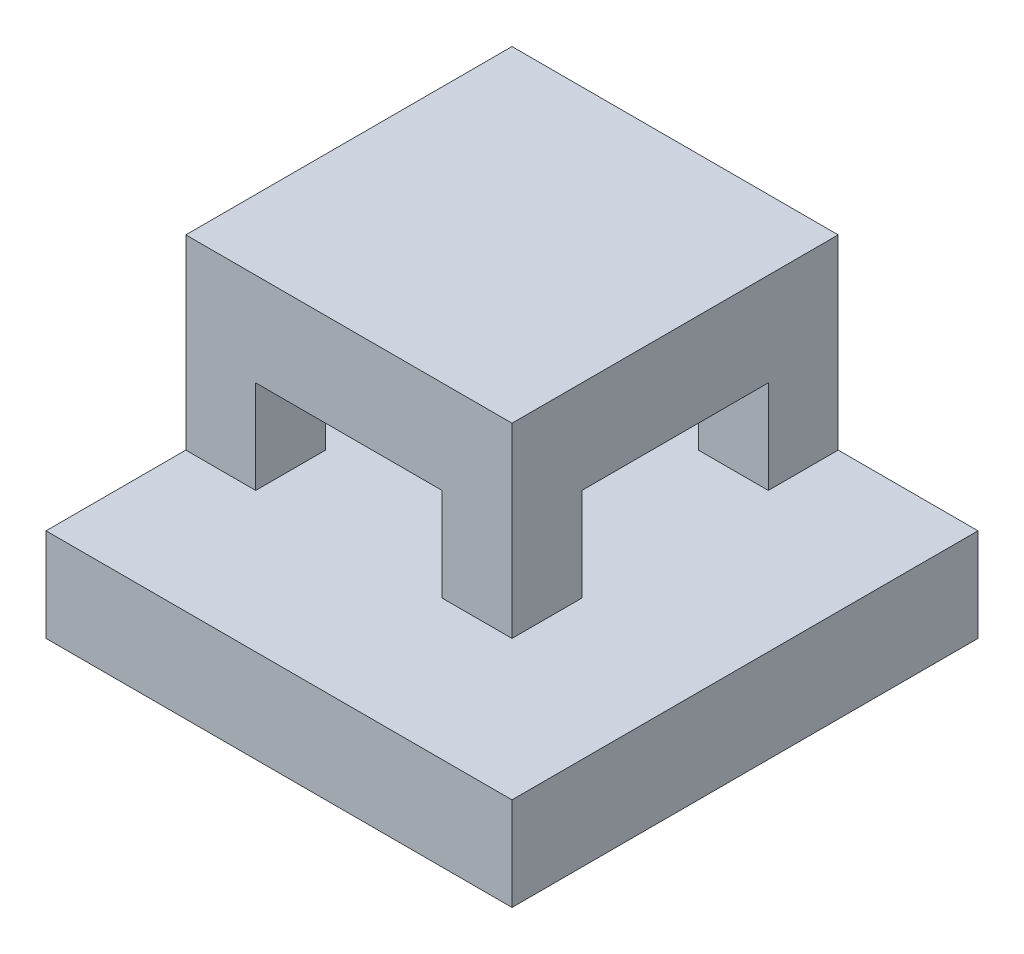
ISO-10303-21;
HEADER;
FILE_DESCRIPTION(('STEP AP214'),'2;1');
FILE_NAME('part.step','',(''),(''),'','','');
FILE_SCHEMA(('AUTOMOTIVE_DESIGN { 1 0 10303 214 1 1 1 1 }'));
ENDSEC;
DATA;
#1=APPLICATION_CONTEXT('core data for automotive mechanical design processes');
#2=APPLICATION_PROTOCOL_DEFINITION('international standard','automotive_design',2000,#1);
#3=PRODUCT_CONTEXT('',#1,'mechanical');
#4=PRODUCT('Part','Part','',(#3));
#5=PRODUCT_RELATED_PRODUCT_CATEGORY('part','',(#4));
#6=PRODUCT_DEFINITION_FORMATION('','',#4);
#7=PRODUCT_DEFINITION_CONTEXT('part definition',#1,'design');
#8=PRODUCT_DEFINITION('design','',#6,#7);
#9=PRODUCT_DEFINITION_SHAPE('','',#8);
#10=(LENGTH_UNIT() NAMED_UNIT(*) SI_UNIT(.MILLI.,.METRE.));
#11=(NAMED_UNIT(*) PLANE_ANGLE_UNIT() SI_UNIT($,.RADIAN.));
#12=(NAMED_UNIT(*) SI_UNIT($,.STERADIAN.) SOLID_ANGLE_UNIT());
#13=UNCERTAINTY_MEASURE_WITH_UNIT(LENGTH_MEASURE(1.E-05),#10,'distance_accuracy_value','');
#14=(GEOMETRIC_REPRESENTATION_CONTEXT(3) GLOBAL_UNCERTAINTY_ASSIGNED_CONTEXT((#13)) GLOBAL_UNIT_ASSIGNED_CONTEXT((#10,
#11,#12)) REPRESENTATION_CONTEXT('',''));
#15=CARTESIAN_POINT('',(0.,0.,0.));
#16=DIRECTION('',(0.,0.,1.));
#17=DIRECTION('',(1.,0.,0.));
#18=AXIS2_PLACEMENT_3D('',#15,#16,#17);
#19=CARTESIAN_POINT('',(0.,20.,0.));
#20=DIRECTION('',(0.,-1.,0.));
#21=DIRECTION('',(0.,0.,-1.));
#22=AXIS2_PLACEMENT_3D('',#19,#20,#21);
#23=PLANE('',#22);
#24=DIRECTION('',(0.,0.,-1.));
#25=VECTOR('',#24,1.);
#26=CARTESIAN_POINT('',(-35.,20.,-35.));
#27=LINE('',#26,#25);
#28=CARTESIAN_POINT('',(-35.,20.,-35.));
#29=VERTEX_POINT('',#28);
#30=CARTESIAN_POINT('',(-35.,20.,-50.));
#31=VERTEX_POINT('',#30);
#32=EDGE_CURVE('E254',#29,#31,#27,.T.);
#33=ORIENTED_EDGE('',*,*,#32,.F.);
#34=DIRECTION('',(1.,0.,0.));
#35=VECTOR('',#34,1.);
#36=CARTESIAN_POINT('',(-50.,20.,-35.));
#37=LINE('',#36,#35);
#38=CARTESIAN_POINT('',(-50.,20.,-35.));
#39=VERTEX_POINT('',#38);
#40=EDGE_CURVE('E260',#39,#29,#37,.T.);
#41=ORIENTED_EDGE('',*,*,#40,.F.);
#42=DIRECTION('',(0.,0.,1.));
#43=VECTOR('',#42,1.);
#44=CARTESIAN_POINT('',(-50.,20.,50.));
#45=LINE('',#44,#43);
#46=CARTESIAN_POINT('',(-50.,20.,5.));
#47=VERTEX_POINT('',#46);
#48=EDGE_CURVE('E362',#39,#47,#45,.T.);
#49=ORIENTED_EDGE('',*,*,#48,.T.);
#50=DIRECTION('',(-1.,0.,0.));
#51=VECTOR('',#50,1.);
#52=CARTESIAN_POINT('',(-50.,20.,5.));
#53=LINE('',#52,#51);
#54=CARTESIAN_POINT('',(-35.,20.,5.));
#55=VERTEX_POINT('',#54);
#56=EDGE_CURVE('E331',#55,#47,#53,.T.);
#57=ORIENTED_EDGE('',*,*,#56,.F.);
#58=DIRECTION('',(0.,0.,-1.));
#59=VECTOR('',#58,1.);
#60=CARTESIAN_POINT('',(-35.,20.,20.));
#61=LINE('',#60,#59);
#62=CARTESIAN_POINT('',(-35.,20.,20.));
#63=VERTEX_POINT('',#62);
#64=EDGE_CURVE('E317',#63,#55,#61,.T.);
#65=ORIENTED_EDGE('',*,*,#64,.F.);
#66=DIRECTION('',(1.,0.,0.));
#67=VECTOR('',#66,1.);
#68=CARTESIAN_POINT('',(-50.,20.,20.));
#69=LINE('',#68,#67);
#70=CARTESIAN_POINT('',(-50.,20.,20.));
#71=VERTEX_POINT('',#70);
#72=EDGE_CURVE('E323',#71,#63,#69,.T.);
#73=ORIENTED_EDGE('',*,*,#72,.F.);
#74=CARTESIAN_POINT('',(-50.,20.,50.));
#75=VERTEX_POINT('',#74);
#76=EDGE_CURVE('E361',#71,#75,#45,.T.);
#77=ORIENTED_EDGE('',*,*,#76,.T.);
#78=DIRECTION('',(1.,0.,0.));
#79=VECTOR('',#78,1.);
#80=CARTESIAN_POINT('',(-50.,20.,50.));
#81=LINE('',#80,#79);
#82=CARTESIAN_POINT('',(50.,20.,50.));
#83=VERTEX_POINT('',#82);
#84=EDGE_CURVE('E365',#75,#83,#81,.T.);
#85=ORIENTED_EDGE('',*,*,#84,.T.);
#86=DIRECTION('',(0.,0.,-1.));
#87=VECTOR('',#86,1.);
#88=CARTESIAN_POINT('',(50.,20.,50.));
#89=LINE('',#88,#87);
#90=CARTESIAN_POINT('',(50.,20.,-50.));
#91=VERTEX_POINT('',#90);
#92=EDGE_CURVE('E352',#83,#91,#89,.T.);
#93=ORIENTED_EDGE('',*,*,#92,.T.);
#94=DIRECTION('',(-1.,0.,0.));
#95=VECTOR('',#94,1.);
#96=CARTESIAN_POINT('',(-50.,20.,-50.));
#97=LINE('',#96,#95);
#98=CARTESIAN_POINT('',(20.,20.,-50.));
#99=VERTEX_POINT('',#98);
#100=EDGE_CURVE('E358',#91,#99,#97,.T.);
#101=ORIENTED_EDGE('',*,*,#100,.T.);
#102=DIRECTION('',(0.,0.,-1.));
#103=VECTOR('',#102,1.);
#104=CARTESIAN_POINT('',(20.,20.,-35.));
#105=LINE('',#104,#103);
#106=CARTESIAN_POINT('',(20.,20.,-35.));
#107=VERTEX_POINT('',#106);
#108=EDGE_CURVE('E282',#107,#99,#105,.T.);
#109=ORIENTED_EDGE('',*,*,#108,.F.);
#110=DIRECTION('',(1.,0.,0.));
#111=VECTOR('',#110,1.);
#112=CARTESIAN_POINT('',(5.,20.,-35.));
#113=LINE('',#112,#111);
#114=CARTESIAN_POINT('',(5.,20.,-35.));
#115=VERTEX_POINT('',#114);
#116=EDGE_CURVE('E288',#115,#107,#113,.T.);
#117=ORIENTED_EDGE('',*,*,#116,.F.);
#118=DIRECTION('',(0.,0.,1.));
#119=VECTOR('',#118,1.);
#120=CARTESIAN_POINT('',(5.,20.,-35.));
#121=LINE('',#120,#119);
#122=CARTESIAN_POINT('',(5.,20.,-50.));
#123=VERTEX_POINT('',#122);
#124=EDGE_CURVE('E296',#123,#115,#121,.T.);
#125=ORIENTED_EDGE('',*,*,#124,.F.);
#126=EDGE_CURVE('E356',#123,#31,#97,.T.);
#127=ORIENTED_EDGE('',*,*,#126,.T.);
#128=EDGE_LOOP('',(#33,#41,#49,#57,#65,#73,#77,#85,#93,#101,#109,#117,#125,#127));
#129=FACE_BOUND('',#128,.T.);
#130=DIRECTION('',(0.,0.,-1.));
#131=VECTOR('',#130,1.);
#132=CARTESIAN_POINT('',(20.,20.,20.));
#133=LINE('',#132,#131);
#134=CARTESIAN_POINT('',(20.,20.,20.));
#135=VERTEX_POINT('',#134);
#136=CARTESIAN_POINT('',(20.,20.,5.));
#137=VERTEX_POINT('',#136);
#138=EDGE_CURVE('E208',#135,#137,#133,.T.);
#139=ORIENTED_EDGE('',*,*,#138,.F.);
#140=DIRECTION('',(1.,0.,0.));
#141=VECTOR('',#140,1.);
#142=CARTESIAN_POINT('',(5.,20.,20.));
#143=LINE('',#142,#141);
#144=CARTESIAN_POINT('',(5.,20.,20.));
#145=VERTEX_POINT('',#144);
#146=EDGE_CURVE('E225',#145,#135,#143,.T.);
#147=ORIENTED_EDGE('',*,*,#146,.F.);
#148=DIRECTION('',(0.,0.,1.));
#149=VECTOR('',#148,1.);
#150=CARTESIAN_POINT('',(5.,20.,20.));
#151=LINE('',#150,#149);
#152=CARTESIAN_POINT('',(5.,20.,5.));
#153=VERTEX_POINT('',#152);
#154=EDGE_CURVE('E60',#153,#145,#151,.T.);
#155=ORIENTED_EDGE('',*,*,#154,.F.);
#156=DIRECTION('',(-1.,0.,0.));
#157=VECTOR('',#156,1.);
#158=CARTESIAN_POINT('',(5.,20.,5.));
#159=LINE('',#158,#157);
#160=EDGE_CURVE('E55',#137,#153,#159,.T.);
#161=ORIENTED_EDGE('',*,*,#160,.F.);
#162=EDGE_LOOP('',(#139,#147,#155,#161));
#163=FACE_BOUND('',#162,.T.);
#164=ADVANCED_FACE('F39',(#129,#163),#23,.F.);
#165=CARTESIAN_POINT('',(50.,20.,50.));
#166=DIRECTION('',(-1.,0.,0.));
#167=DIRECTION('',(0.,0.,1.));
#168=AXIS2_PLACEMENT_3D('',#165,#166,#167);
#169=PLANE('',#168);
#170=DIRECTION('',(0.,0.,-1.));
#171=VECTOR('',#170,1.);
#172=CARTESIAN_POINT('',(50.,0.,50.));
#173=LINE('',#172,#171);
#174=CARTESIAN_POINT('',(50.,0.,50.));
#175=VERTEX_POINT('',#174);
#176=CARTESIAN_POINT('',(50.,0.,-50.));
#177=VERTEX_POINT('',#176);
#178=EDGE_CURVE('E351',#175,#177,#173,.T.);
#179=ORIENTED_EDGE('',*,*,#178,.T.);
#180=DIRECTION('',(0.,-1.,0.));
#181=VECTOR('',#180,1.);
#182=CARTESIAN_POINT('',(50.,20.,-50.));
#183=LINE('',#182,#181);
#184=EDGE_CURVE('E11',#91,#177,#183,.T.);
#185=ORIENTED_EDGE('',*,*,#184,.F.);
#186=ORIENTED_EDGE('',*,*,#92,.F.);
#187=DIRECTION('',(0.,-1.,0.));
#188=VECTOR('',#187,1.);
#189=CARTESIAN_POINT('',(50.,20.,50.));
#190=LINE('',#189,#188);
#191=EDGE_CURVE('E368',#83,#175,#190,.T.);
#192=ORIENTED_EDGE('',*,*,#191,.T.);
#193=EDGE_LOOP('',(#179,#185,#186,#192));
#194=FACE_BOUND('',#193,.T.);
#195=ADVANCED_FACE('F41',(#194),#169,.F.);
#196=CARTESIAN_POINT('',(-50.,20.,-50.));
#197=DIRECTION('',(0.,0.,1.));
#198=DIRECTION('',(1.,0.,0.));
#199=AXIS2_PLACEMENT_3D('',#196,#197,#198);
#200=PLANE('',#199);
#201=DIRECTION('',(0.,-1.,0.));
#202=VECTOR('',#201,1.);
#203=CARTESIAN_POINT('',(5.,40.,-50.));
#204=LINE('',#203,#202);
#205=CARTESIAN_POINT('',(5.,40.,-50.));
#206=VERTEX_POINT('',#205);
#207=EDGE_CURVE('E310',#206,#123,#204,.T.);
#208=ORIENTED_EDGE('',*,*,#207,.F.);
#209=DIRECTION('',(-1.,0.,0.));
#210=VECTOR('',#209,1.);
#211=CARTESIAN_POINT('',(-50.,40.,-50.));
#212=LINE('',#211,#210);
#213=CARTESIAN_POINT('',(-35.,40.,-50.));
#214=VERTEX_POINT('',#213);
#215=EDGE_CURVE('E209',#206,#214,#212,.T.);
#216=ORIENTED_EDGE('',*,*,#215,.T.);
#217=DIRECTION('',(0.,-1.,0.));
#218=VECTOR('',#217,1.);
#219=CARTESIAN_POINT('',(-35.,40.,-50.));
#220=LINE('',#219,#218);
#221=EDGE_CURVE('E278',#214,#31,#220,.T.);
#222=ORIENTED_EDGE('',*,*,#221,.T.);
#223=ORIENTED_EDGE('',*,*,#126,.F.);
#224=EDGE_LOOP('',(#208,#216,#222,#223));
#225=FACE_BOUND('',#224,.T.);
#226=DIRECTION('',(-1.,0.,0.));
#227=VECTOR('',#226,1.);
#228=CARTESIAN_POINT('',(-50.,0.,-50.));
#229=LINE('',#228,#227);
#230=CARTESIAN_POINT('',(-50.,0.,-50.));
#231=VERTEX_POINT('',#230);
#232=EDGE_CURVE('E174',#177,#231,#229,.T.);
#233=ORIENTED_EDGE('',*,*,#232,.T.);
#234=DIRECTION('',(0.,-1.,0.));
#235=VECTOR('',#234,1.);
#236=CARTESIAN_POINT('',(-50.,20.,-50.));
#237=LINE('',#236,#235);
#238=CARTESIAN_POINT('',(-50.,60.,-50.));
#239=VERTEX_POINT('',#238);
#240=EDGE_CURVE('E48',#239,#231,#237,.T.);
#241=ORIENTED_EDGE('',*,*,#240,.F.);
#242=DIRECTION('',(-1.,0.,0.));
#243=VECTOR('',#242,1.);
#244=CARTESIAN_POINT('',(-50.,60.,-50.));
#245=LINE('',#244,#243);
#246=CARTESIAN_POINT('',(20.,60.,-50.));
#247=VERTEX_POINT('',#246);
#248=EDGE_CURVE('E173',#247,#239,#245,.T.);
#249=ORIENTED_EDGE('',*,*,#248,.F.);
#250=DIRECTION('',(0.,-1.,0.));
#251=VECTOR('',#250,1.);
#252=CARTESIAN_POINT('',(20.,40.,-50.));
#253=LINE('',#252,#251);
#254=EDGE_CURVE('E314',#247,#99,#253,.T.);
#255=ORIENTED_EDGE('',*,*,#254,.T.);
#256=ORIENTED_EDGE('',*,*,#100,.F.);
#257=ORIENTED_EDGE('',*,*,#184,.T.);
#258=EDGE_LOOP('',(#233,#241,#249,#255,#256,#257));
#259=FACE_BOUND('',#258,.T.);
#260=ADVANCED_FACE('F170',(#225,#259),#200,.F.);
#261=CARTESIAN_POINT('',(-50.,20.,50.));
#262=DIRECTION('',(1.,0.,0.));
#263=DIRECTION('',(0.,0.,-1.));
#264=AXIS2_PLACEMENT_3D('',#261,#262,#263);
#265=PLANE('',#264);
#266=DIRECTION('',(0.,-1.,0.));
#267=VECTOR('',#266,1.);
#268=CARTESIAN_POINT('',(-50.,40.,20.));
#269=LINE('',#268,#267);
#270=CARTESIAN_POINT('',(-50.,60.,20.));
#271=VERTEX_POINT('',#270);
#272=EDGE_CURVE('E185',#271,#71,#269,.T.);
#273=ORIENTED_EDGE('',*,*,#272,.F.);
#274=DIRECTION('',(0.,0.,1.));
#275=VECTOR('',#274,1.);
#276=CARTESIAN_POINT('',(-50.,60.,20.));
#277=LINE('',#276,#275);
#278=EDGE_CURVE('E180',#239,#271,#277,.T.);
#279=ORIENTED_EDGE('',*,*,#278,.F.);
#280=ORIENTED_EDGE('',*,*,#240,.T.);
#281=DIRECTION('',(0.,0.,1.));
#282=VECTOR('',#281,1.);
#283=CARTESIAN_POINT('',(-50.,0.,50.));
#284=LINE('',#283,#282);
#285=CARTESIAN_POINT('',(-50.,0.,50.));
#286=VERTEX_POINT('',#285);
#287=EDGE_CURVE('E374',#231,#286,#284,.T.);
#288=ORIENTED_EDGE('',*,*,#287,.T.);
#289=DIRECTION('',(0.,-1.,0.));
#290=VECTOR('',#289,1.);
#291=CARTESIAN_POINT('',(-50.,20.,50.));
#292=LINE('',#291,#290);
#293=EDGE_CURVE('E178',#75,#286,#292,.T.);
#294=ORIENTED_EDGE('',*,*,#293,.F.);
#295=ORIENTED_EDGE('',*,*,#76,.F.);
#296=EDGE_LOOP('',(#273,#279,#280,#288,#294,#295));
#297=FACE_BOUND('',#296,.T.);
#298=DIRECTION('',(0.,0.,1.));
#299=VECTOR('',#298,1.);
#300=CARTESIAN_POINT('',(-50.,40.,20.));
#301=LINE('',#300,#299);
#302=CARTESIAN_POINT('',(-50.,40.,-35.));
#303=VERTEX_POINT('',#302);
#304=CARTESIAN_POINT('',(-50.,40.,5.));
#305=VERTEX_POINT('',#304);
#306=EDGE_CURVE('E213',#303,#305,#301,.T.);
#307=ORIENTED_EDGE('',*,*,#306,.T.);
#308=DIRECTION('',(0.,-1.,0.));
#309=VECTOR('',#308,1.);
#310=CARTESIAN_POINT('',(-50.,40.,5.));
#311=LINE('',#310,#309);
#312=EDGE_CURVE('E343',#305,#47,#311,.T.);
#313=ORIENTED_EDGE('',*,*,#312,.T.);
#314=ORIENTED_EDGE('',*,*,#48,.F.);
#315=DIRECTION('',(0.,-1.,0.));
#316=VECTOR('',#315,1.);
#317=CARTESIAN_POINT('',(-50.,40.,-35.));
#318=LINE('',#317,#316);
#319=EDGE_CURVE('E274',#303,#39,#318,.T.);
#320=ORIENTED_EDGE('',*,*,#319,.F.);
#321=EDGE_LOOP('',(#307,#313,#314,#320));
#322=FACE_BOUND('',#321,.T.);
#323=ADVANCED_FACE('F181',(#297,#322),#265,.F.);
#324=CARTESIAN_POINT('',(-50.,20.,50.));
#325=DIRECTION('',(0.,0.,-1.));
#326=DIRECTION('',(-1.,0.,0.));
#327=AXIS2_PLACEMENT_3D('',#324,#325,#326);
#328=PLANE('',#327);
#329=DIRECTION('',(1.,0.,0.));
#330=VECTOR('',#329,1.);
#331=CARTESIAN_POINT('',(-50.,0.,50.));
#332=LINE('',#331,#330);
#333=EDGE_CURVE('E357',#286,#175,#332,.T.);
#334=ORIENTED_EDGE('',*,*,#333,.T.);
#335=ORIENTED_EDGE('',*,*,#191,.F.);
#336=ORIENTED_EDGE('',*,*,#84,.F.);
#337=ORIENTED_EDGE('',*,*,#293,.T.);
#338=EDGE_LOOP('',(#334,#335,#336,#337));
#339=FACE_BOUND('',#338,.T.);
#340=ADVANCED_FACE('F388',(#339),#328,.F.);
#341=CARTESIAN_POINT('',(0.,0.,0.));
#342=DIRECTION('',(0.,-1.,0.));
#343=DIRECTION('',(0.,0.,-1.));
#344=AXIS2_PLACEMENT_3D('',#341,#342,#343);
#345=PLANE('',#344);
#346=ORIENTED_EDGE('',*,*,#178,.F.);
#347=ORIENTED_EDGE('',*,*,#333,.F.);
#348=ORIENTED_EDGE('',*,*,#287,.F.);
#349=ORIENTED_EDGE('',*,*,#232,.F.);
#350=EDGE_LOOP('',(#346,#347,#348,#349));
#351=FACE_BOUND('',#350,.T.);
#352=ADVANCED_FACE('F392',(#351),#345,.T.);
#353=CARTESIAN_POINT('',(-35.,40.,20.));
#354=DIRECTION('',(-1.,0.,0.));
#355=DIRECTION('',(0.,0.,1.));
#356=AXIS2_PLACEMENT_3D('',#353,#354,#355);
#357=PLANE('',#356);
#358=ORIENTED_EDGE('',*,*,#64,.T.);
#359=DIRECTION('',(0.,-1.,0.));
#360=VECTOR('',#359,1.);
#361=CARTESIAN_POINT('',(-35.,40.,5.));
#362=LINE('',#361,#360);
#363=CARTESIAN_POINT('',(-35.,40.,5.));
#364=VERTEX_POINT('',#363);
#365=EDGE_CURVE('E347',#364,#55,#362,.T.);
#366=ORIENTED_EDGE('',*,*,#365,.F.);
#367=DIRECTION('',(0.,0.,-1.));
#368=VECTOR('',#367,1.);
#369=CARTESIAN_POINT('',(-35.,40.,20.));
#370=LINE('',#369,#368);
#371=CARTESIAN_POINT('',(-35.,40.,20.));
#372=VERTEX_POINT('',#371);
#373=EDGE_CURVE('E318',#372,#364,#370,.T.);
#374=ORIENTED_EDGE('',*,*,#373,.F.);
#375=DIRECTION('',(0.,-1.,0.));
#376=VECTOR('',#375,1.);
#377=CARTESIAN_POINT('',(-35.,40.,20.));
#378=LINE('',#377,#376);
#379=EDGE_CURVE('E327',#372,#63,#378,.T.);
#380=ORIENTED_EDGE('',*,*,#379,.T.);
#381=EDGE_LOOP('',(#358,#366,#374,#380));
#382=FACE_BOUND('',#381,.T.);
#383=ADVANCED_FACE('F418',(#382),#357,.F.);
#384=CARTESIAN_POINT('',(-50.,40.,5.));
#385=DIRECTION('',(0.,0.,1.));
#386=DIRECTION('',(1.,0.,0.));
#387=AXIS2_PLACEMENT_3D('',#384,#385,#386);
#388=PLANE('',#387);
#389=ORIENTED_EDGE('',*,*,#56,.T.);
#390=ORIENTED_EDGE('',*,*,#312,.F.);
#391=DIRECTION('',(-1.,0.,0.));
#392=VECTOR('',#391,1.);
#393=CARTESIAN_POINT('',(-50.,40.,5.));
#394=LINE('',#393,#392);
#395=EDGE_CURVE('E322',#364,#305,#394,.T.);
#396=ORIENTED_EDGE('',*,*,#395,.F.);
#397=ORIENTED_EDGE('',*,*,#365,.T.);
#398=EDGE_LOOP('',(#389,#390,#396,#397));
#399=FACE_BOUND('',#398,.T.);
#400=ADVANCED_FACE('F410',(#399),#388,.F.);
#401=CARTESIAN_POINT('',(-50.,40.,20.));
#402=DIRECTION('',(0.,0.,-1.));
#403=DIRECTION('',(-1.,0.,0.));
#404=AXIS2_PLACEMENT_3D('',#401,#402,#403);
#405=PLANE('',#404);
#406=ORIENTED_EDGE('',*,*,#72,.T.);
#407=ORIENTED_EDGE('',*,*,#379,.F.);
#408=DIRECTION('',(1.,0.,0.));
#409=VECTOR('',#408,1.);
#410=CARTESIAN_POINT('',(-50.,40.,20.));
#411=LINE('',#410,#409);
#412=CARTESIAN_POINT('',(5.,40.,20.));
#413=VERTEX_POINT('',#412);
#414=EDGE_CURVE('E201',#372,#413,#411,.T.);
#415=ORIENTED_EDGE('',*,*,#414,.T.);
#416=DIRECTION('',(0.,-1.,0.));
#417=VECTOR('',#416,1.);
#418=CARTESIAN_POINT('',(5.,40.,20.));
#419=LINE('',#418,#417);
#420=EDGE_CURVE('E243',#413,#145,#419,.T.);
#421=ORIENTED_EDGE('',*,*,#420,.T.);
#422=ORIENTED_EDGE('',*,*,#146,.T.);
#423=DIRECTION('',(0.,-1.,0.));
#424=VECTOR('',#423,1.);
#425=CARTESIAN_POINT('',(20.,40.,20.));
#426=LINE('',#425,#424);
#427=CARTESIAN_POINT('',(20.,60.,20.));
#428=VERTEX_POINT('',#427);
#429=EDGE_CURVE('E229',#428,#135,#426,.T.);
#430=ORIENTED_EDGE('',*,*,#429,.F.);
#431=DIRECTION('',(1.,0.,0.));
#432=VECTOR('',#431,1.);
#433=CARTESIAN_POINT('',(-50.,60.,20.));
#434=LINE('',#433,#432);
#435=EDGE_CURVE('E190',#271,#428,#434,.T.);
#436=ORIENTED_EDGE('',*,*,#435,.F.);
#437=ORIENTED_EDGE('',*,*,#272,.T.);
#438=EDGE_LOOP('',(#406,#407,#415,#421,#422,#430,#436,#437));
#439=FACE_BOUND('',#438,.T.);
#440=ADVANCED_FACE('F421',(#439),#405,.F.);
#441=CARTESIAN_POINT('',(20.,40.,-35.));
#442=DIRECTION('',(-1.,0.,0.));
#443=DIRECTION('',(0.,0.,1.));
#444=AXIS2_PLACEMENT_3D('',#441,#442,#443);
#445=PLANE('',#444);
#446=ORIENTED_EDGE('',*,*,#108,.T.);
#447=ORIENTED_EDGE('',*,*,#254,.F.);
#448=DIRECTION('',(0.,0.,-1.));
#449=VECTOR('',#448,1.);
#450=CARTESIAN_POINT('',(20.,60.,20.));
#451=LINE('',#450,#449);
#452=EDGE_CURVE('E195',#428,#247,#451,.T.);
#453=ORIENTED_EDGE('',*,*,#452,.F.);
#454=ORIENTED_EDGE('',*,*,#429,.T.);
#455=ORIENTED_EDGE('',*,*,#138,.T.);
#456=DIRECTION('',(0.,-1.,0.));
#457=VECTOR('',#456,1.);
#458=CARTESIAN_POINT('',(20.,40.,5.));
#459=LINE('',#458,#457);
#460=CARTESIAN_POINT('',(20.,40.,5.));
#461=VERTEX_POINT('',#460);
#462=EDGE_CURVE('E251',#461,#137,#459,.T.);
#463=ORIENTED_EDGE('',*,*,#462,.F.);
#464=DIRECTION('',(0.,0.,-1.));
#465=VECTOR('',#464,1.);
#466=CARTESIAN_POINT('',(20.,40.,20.));
#467=LINE('',#466,#465);
#468=CARTESIAN_POINT('',(20.,40.,-35.));
#469=VERTEX_POINT('',#468);
#470=EDGE_CURVE('E197',#461,#469,#467,.T.);
#471=ORIENTED_EDGE('',*,*,#470,.T.);
#472=DIRECTION('',(0.,-1.,0.));
#473=VECTOR('',#472,1.);
#474=CARTESIAN_POINT('',(20.,40.,-35.));
#475=LINE('',#474,#473);
#476=EDGE_CURVE('E292',#469,#107,#475,.T.);
#477=ORIENTED_EDGE('',*,*,#476,.T.);
#478=EDGE_LOOP('',(#446,#447,#453,#454,#455,#463,#471,#477));
#479=FACE_BOUND('',#478,.T.);
#480=ADVANCED_FACE('F423',(#479),#445,.F.);
#481=CARTESIAN_POINT('',(5.,40.,-35.));
#482=DIRECTION('',(1.,0.,0.));
#483=DIRECTION('',(0.,0.,-1.));
#484=AXIS2_PLACEMENT_3D('',#481,#482,#483);
#485=PLANE('',#484);
#486=ORIENTED_EDGE('',*,*,#124,.T.);
#487=DIRECTION('',(0.,-1.,0.));
#488=VECTOR('',#487,1.);
#489=CARTESIAN_POINT('',(5.,40.,-35.));
#490=LINE('',#489,#488);
#491=CARTESIAN_POINT('',(5.,40.,-35.));
#492=VERTEX_POINT('',#491);
#493=EDGE_CURVE('E306',#492,#115,#490,.T.);
#494=ORIENTED_EDGE('',*,*,#493,.F.);
#495=DIRECTION('',(0.,0.,1.));
#496=VECTOR('',#495,1.);
#497=CARTESIAN_POINT('',(5.,40.,-35.));
#498=LINE('',#497,#496);
#499=EDGE_CURVE('E283',#206,#492,#498,.T.);
#500=ORIENTED_EDGE('',*,*,#499,.F.);
#501=ORIENTED_EDGE('',*,*,#207,.T.);
#502=EDGE_LOOP('',(#486,#494,#500,#501));
#503=FACE_BOUND('',#502,.T.);
#504=ADVANCED_FACE('F429',(#503),#485,.F.);
#505=CARTESIAN_POINT('',(5.,40.,-35.));
#506=DIRECTION('',(0.,0.,-1.));
#507=DIRECTION('',(-1.,0.,0.));
#508=AXIS2_PLACEMENT_3D('',#505,#506,#507);
#509=PLANE('',#508);
#510=ORIENTED_EDGE('',*,*,#116,.T.);
#511=ORIENTED_EDGE('',*,*,#476,.F.);
#512=DIRECTION('',(1.,0.,0.));
#513=VECTOR('',#512,1.);
#514=CARTESIAN_POINT('',(5.,40.,-35.));
#515=LINE('',#514,#513);
#516=EDGE_CURVE('E287',#492,#469,#515,.T.);
#517=ORIENTED_EDGE('',*,*,#516,.F.);
#518=ORIENTED_EDGE('',*,*,#493,.T.);
#519=EDGE_LOOP('',(#510,#511,#517,#518));
#520=FACE_BOUND('',#519,.T.);
#521=ADVANCED_FACE('F425',(#520),#509,.F.);
#522=CARTESIAN_POINT('',(-35.,40.,-35.));
#523=DIRECTION('',(-1.,0.,0.));
#524=DIRECTION('',(0.,0.,1.));
#525=AXIS2_PLACEMENT_3D('',#522,#523,#524);
#526=PLANE('',#525);
#527=ORIENTED_EDGE('',*,*,#32,.T.);
#528=ORIENTED_EDGE('',*,*,#221,.F.);
#529=DIRECTION('',(0.,0.,-1.));
#530=VECTOR('',#529,1.);
#531=CARTESIAN_POINT('',(-35.,40.,-35.));
#532=LINE('',#531,#530);
#533=CARTESIAN_POINT('',(-35.,40.,-35.));
#534=VERTEX_POINT('',#533);
#535=EDGE_CURVE('E255',#534,#214,#532,.T.);
#536=ORIENTED_EDGE('',*,*,#535,.F.);
#537=DIRECTION('',(0.,-1.,0.));
#538=VECTOR('',#537,1.);
#539=CARTESIAN_POINT('',(-35.,40.,-35.));
#540=LINE('',#539,#538);
#541=EDGE_CURVE('E264',#534,#29,#540,.T.);
#542=ORIENTED_EDGE('',*,*,#541,.T.);
#543=EDGE_LOOP('',(#527,#528,#536,#542));
#544=FACE_BOUND('',#543,.T.);
#545=ADVANCED_FACE('F405',(#544),#526,.F.);
#546=CARTESIAN_POINT('',(-50.,40.,-35.));
#547=DIRECTION('',(0.,0.,-1.));
#548=DIRECTION('',(-1.,0.,0.));
#549=AXIS2_PLACEMENT_3D('',#546,#547,#548);
#550=PLANE('',#549);
#551=ORIENTED_EDGE('',*,*,#40,.T.);
#552=ORIENTED_EDGE('',*,*,#541,.F.);
#553=DIRECTION('',(1.,0.,0.));
#554=VECTOR('',#553,1.);
#555=CARTESIAN_POINT('',(-50.,40.,-35.));
#556=LINE('',#555,#554);
#557=EDGE_CURVE('E259',#303,#534,#556,.T.);
#558=ORIENTED_EDGE('',*,*,#557,.F.);
#559=ORIENTED_EDGE('',*,*,#319,.T.);
#560=EDGE_LOOP('',(#551,#552,#558,#559));
#561=FACE_BOUND('',#560,.T.);
#562=ADVANCED_FACE('F407',(#561),#550,.F.);
#563=CARTESIAN_POINT('',(5.,40.,5.));
#564=DIRECTION('',(0.,0.,1.));
#565=DIRECTION('',(1.,0.,0.));
#566=AXIS2_PLACEMENT_3D('',#563,#564,#565);
#567=PLANE('',#566);
#568=ORIENTED_EDGE('',*,*,#160,.T.);
#569=DIRECTION('',(0.,-1.,0.));
#570=VECTOR('',#569,1.);
#571=CARTESIAN_POINT('',(5.,40.,5.));
#572=LINE('',#571,#570);
#573=CARTESIAN_POINT('',(5.,40.,5.));
#574=VERTEX_POINT('',#573);
#575=EDGE_CURVE('E247',#574,#153,#572,.T.);
#576=ORIENTED_EDGE('',*,*,#575,.F.);
#577=DIRECTION('',(-1.,0.,0.));
#578=VECTOR('',#577,1.);
#579=CARTESIAN_POINT('',(5.,40.,5.));
#580=LINE('',#579,#578);
#581=EDGE_CURVE('E220',#461,#574,#580,.T.);
#582=ORIENTED_EDGE('',*,*,#581,.F.);
#583=ORIENTED_EDGE('',*,*,#462,.T.);
#584=EDGE_LOOP('',(#568,#576,#582,#583));
#585=FACE_BOUND('',#584,.T.);
#586=ADVANCED_FACE('F432',(#585),#567,.F.);
#587=CARTESIAN_POINT('',(5.,40.,20.));
#588=DIRECTION('',(1.,0.,0.));
#589=DIRECTION('',(0.,0.,-1.));
#590=AXIS2_PLACEMENT_3D('',#587,#588,#589);
#591=PLANE('',#590);
#592=ORIENTED_EDGE('',*,*,#154,.T.);
#593=ORIENTED_EDGE('',*,*,#420,.F.);
#594=DIRECTION('',(0.,0.,1.));
#595=VECTOR('',#594,1.);
#596=CARTESIAN_POINT('',(5.,40.,20.));
#597=LINE('',#596,#595);
#598=EDGE_CURVE('E224',#574,#413,#597,.T.);
#599=ORIENTED_EDGE('',*,*,#598,.F.);
#600=ORIENTED_EDGE('',*,*,#575,.T.);
#601=EDGE_LOOP('',(#592,#593,#599,#600));
#602=FACE_BOUND('',#601,.T.);
#603=ADVANCED_FACE('F435',(#602),#591,.F.);
#604=CARTESIAN_POINT('',(0.,40.,0.));
#605=DIRECTION('',(0.,1.,0.));
#606=DIRECTION('',(0.,0.,1.));
#607=AXIS2_PLACEMENT_3D('',#604,#605,#606);
#608=PLANE('',#607);
#609=ORIENTED_EDGE('',*,*,#470,.F.);
#610=ORIENTED_EDGE('',*,*,#581,.T.);
#611=ORIENTED_EDGE('',*,*,#598,.T.);
#612=ORIENTED_EDGE('',*,*,#414,.F.);
#613=ORIENTED_EDGE('',*,*,#373,.T.);
#614=ORIENTED_EDGE('',*,*,#395,.T.);
#615=ORIENTED_EDGE('',*,*,#306,.F.);
#616=ORIENTED_EDGE('',*,*,#557,.T.);
#617=ORIENTED_EDGE('',*,*,#535,.T.);
#618=ORIENTED_EDGE('',*,*,#215,.F.);
#619=ORIENTED_EDGE('',*,*,#499,.T.);
#620=ORIENTED_EDGE('',*,*,#516,.T.);
#621=EDGE_LOOP('',(#609,#610,#611,#612,#613,#614,#615,#616,#617,#618,#619,#620));
#622=FACE_BOUND('',#621,.T.);
#623=ADVANCED_FACE('F415',(#622),#608,.F.);
#624=CARTESIAN_POINT('',(0.,60.,0.));
#625=DIRECTION('',(0.,1.,0.));
#626=DIRECTION('',(0.,0.,1.));
#627=AXIS2_PLACEMENT_3D('',#624,#625,#626);
#628=PLANE('',#627);
#629=ORIENTED_EDGE('',*,*,#248,.T.);
#630=ORIENTED_EDGE('',*,*,#278,.T.);
#631=ORIENTED_EDGE('',*,*,#435,.T.);
#632=ORIENTED_EDGE('',*,*,#452,.T.);
#633=EDGE_LOOP('',(#629,#630,#631,#632));
#634=FACE_BOUND('',#633,.T.);
#635=ADVANCED_FACE('F193',(#634),#628,.T.);
#636=CLOSED_SHELL('',(#164,#195,#260,#323,#340,#352,#383,#400,#440,#480,#504,#521,#545,#562,
#586,#603,#623,#635));
#637=MANIFOLD_SOLID_BREP('B2',#636);
#638=ADVANCED_BREP_SHAPE_REPRESENTATION('',(#18,#637),#14);
#639=SHAPE_DEFINITION_REPRESENTATION(#9,#638);
ENDSEC;
END-ISO-10303-21;
